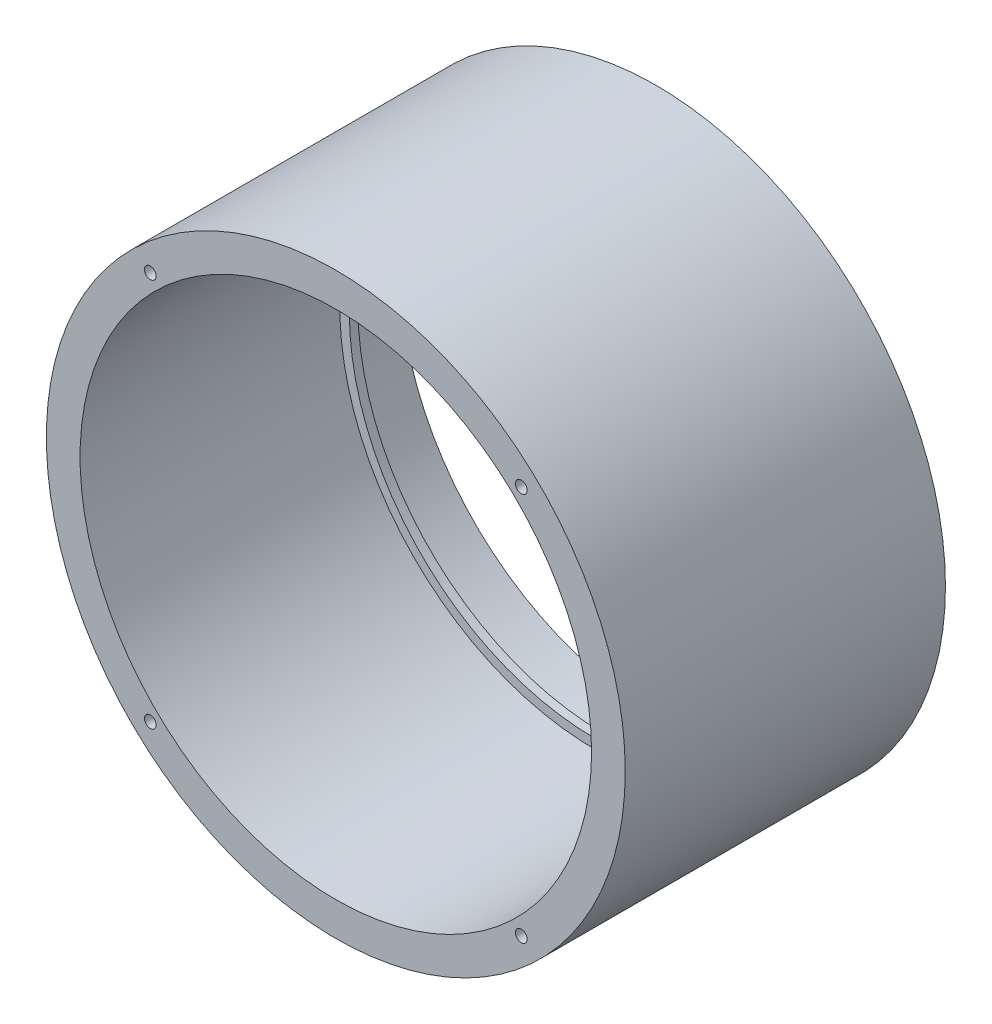
ISO-10303-21;
HEADER;
FILE_DESCRIPTION(('STEP AP214'),'2;1');
FILE_NAME('part.step','',(''),(''),'','','');
FILE_SCHEMA(('AUTOMOTIVE_DESIGN { 1 0 10303 214 1 1 1 1 }'));
ENDSEC;
DATA;
#1=APPLICATION_CONTEXT('core data for automotive mechanical design processes');
#2=APPLICATION_PROTOCOL_DEFINITION('international standard','automotive_design',2000,#1);
#3=PRODUCT_CONTEXT('',#1,'mechanical');
#4=PRODUCT('Part','Part','',(#3));
#5=PRODUCT_RELATED_PRODUCT_CATEGORY('part','',(#4));
#6=PRODUCT_DEFINITION_FORMATION('','',#4);
#7=PRODUCT_DEFINITION_CONTEXT('part definition',#1,'design');
#8=PRODUCT_DEFINITION('design','',#6,#7);
#9=PRODUCT_DEFINITION_SHAPE('','',#8);
#10=(LENGTH_UNIT() NAMED_UNIT(*) SI_UNIT(.MILLI.,.METRE.));
#11=(NAMED_UNIT(*) PLANE_ANGLE_UNIT() SI_UNIT($,.RADIAN.));
#12=(NAMED_UNIT(*) SI_UNIT($,.STERADIAN.) SOLID_ANGLE_UNIT());
#13=UNCERTAINTY_MEASURE_WITH_UNIT(LENGTH_MEASURE(1.E-05),#10,'distance_accuracy_value','');
#14=(GEOMETRIC_REPRESENTATION_CONTEXT(3) GLOBAL_UNCERTAINTY_ASSIGNED_CONTEXT((#13)) GLOBAL_UNIT_ASSIGNED_CONTEXT((#10,
#11,#12)) REPRESENTATION_CONTEXT('',''));
#15=CARTESIAN_POINT('',(0.,0.,0.));
#16=DIRECTION('',(0.,0.,1.));
#17=DIRECTION('',(1.,0.,0.));
#18=AXIS2_PLACEMENT_3D('',#15,#16,#17);
#19=CARTESIAN_POINT('',(0.,0.,185.3));
#20=DIRECTION('',(0.,0.,-1.));
#21=DIRECTION('',(-1.,0.,0.));
#22=AXIS2_PLACEMENT_3D('',#19,#20,#21);
#23=CYLINDRICAL_SURFACE('',#22,148.);
#24=CARTESIAN_POINT('',(0.,0.,35.));
#25=DIRECTION('',(0.,0.,1.));
#26=DIRECTION('',(1.,0.,0.));
#27=AXIS2_PLACEMENT_3D('',#24,#25,#26);
#28=CIRCLE('',#27,148.);
#29=CARTESIAN_POINT('',(148.,0.,35.));
#30=VERTEX_POINT('',#29);
#31=EDGE_CURVE('E10',#30,#30,#28,.T.);
#32=ORIENTED_EDGE('',*,*,#31,.F.);
#33=EDGE_LOOP('',(#32));
#34=FACE_BOUND('',#33,.T.);
#35=CARTESIAN_POINT('',(0.,0.,185.3));
#36=DIRECTION('',(0.,0.,1.));
#37=DIRECTION('',(1.,0.,0.));
#38=AXIS2_PLACEMENT_3D('',#35,#36,#37);
#39=CIRCLE('',#38,148.);
#40=CARTESIAN_POINT('',(148.,0.,185.3));
#41=VERTEX_POINT('',#40);
#42=EDGE_CURVE('E50',#41,#41,#39,.T.);
#43=ORIENTED_EDGE('',*,*,#42,.T.);
#44=EDGE_LOOP('',(#43));
#45=FACE_BOUND('',#44,.T.);
#46=ADVANCED_FACE('F31',(#34,#45),#23,.F.);
#47=CARTESIAN_POINT('',(0.,0.,185.3));
#48=DIRECTION('',(0.,0.,1.));
#49=DIRECTION('',(1.,0.,0.));
#50=AXIS2_PLACEMENT_3D('',#47,#48,#49);
#51=PLANE('',#50);
#52=CARTESIAN_POINT('',(-107.349895202557,112.5,185.3));
#53=DIRECTION('',(0.,0.,-1.));
#54=DIRECTION('',(-1.,0.,0.));
#55=AXIS2_PLACEMENT_3D('',#52,#53,#54);
#56=CIRCLE('',#55,3.4);
#57=CARTESIAN_POINT('',(-110.749895202557,112.5,185.3));
#58=VERTEX_POINT('',#57);
#59=EDGE_CURVE('E94',#58,#58,#56,.T.);
#60=ORIENTED_EDGE('',*,*,#59,.T.);
#61=EDGE_LOOP('',(#60));
#62=FACE_BOUND('',#61,.T.);
#63=CARTESIAN_POINT('',(107.349895202557,112.5,185.3));
#64=DIRECTION('',(0.,0.,-1.));
#65=DIRECTION('',(-1.,0.,0.));
#66=AXIS2_PLACEMENT_3D('',#63,#64,#65);
#67=CIRCLE('',#66,3.4);
#68=CARTESIAN_POINT('',(103.949895202557,112.5,185.3));
#69=VERTEX_POINT('',#68);
#70=EDGE_CURVE('E100',#69,#69,#67,.T.);
#71=ORIENTED_EDGE('',*,*,#70,.T.);
#72=EDGE_LOOP('',(#71));
#73=FACE_BOUND('',#72,.T.);
#74=CARTESIAN_POINT('',(107.349895202557,-112.5,185.3));
#75=DIRECTION('',(0.,0.,-1.));
#76=DIRECTION('',(-1.,0.,0.));
#77=AXIS2_PLACEMENT_3D('',#74,#75,#76);
#78=CIRCLE('',#77,3.4);
#79=CARTESIAN_POINT('',(103.949895202557,-112.5,185.3));
#80=VERTEX_POINT('',#79);
#81=EDGE_CURVE('E106',#80,#80,#78,.T.);
#82=ORIENTED_EDGE('',*,*,#81,.T.);
#83=EDGE_LOOP('',(#82));
#84=FACE_BOUND('',#83,.T.);
#85=CARTESIAN_POINT('',(-107.349895202557,-112.5,185.3));
#86=DIRECTION('',(0.,0.,-1.));
#87=DIRECTION('',(-1.,0.,0.));
#88=AXIS2_PLACEMENT_3D('',#85,#86,#87);
#89=CIRCLE('',#88,3.4);
#90=CARTESIAN_POINT('',(-110.749895202557,-112.5,185.3));
#91=VERTEX_POINT('',#90);
#92=EDGE_CURVE('E88',#91,#91,#89,.T.);
#93=ORIENTED_EDGE('',*,*,#92,.T.);
#94=EDGE_LOOP('',(#93));
#95=FACE_BOUND('',#94,.T.);
#96=CARTESIAN_POINT('',(0.,0.,185.3));
#97=DIRECTION('',(0.,0.,1.));
#98=DIRECTION('',(1.,0.,0.));
#99=AXIS2_PLACEMENT_3D('',#96,#97,#98);
#100=CIRCLE('',#99,167.5);
#101=CARTESIAN_POINT('',(167.5,0.,185.3));
#102=VERTEX_POINT('',#101);
#103=EDGE_CURVE('E42',#102,#102,#100,.T.);
#104=ORIENTED_EDGE('',*,*,#103,.T.);
#105=EDGE_LOOP('',(#104));
#106=FACE_BOUND('',#105,.T.);
#107=ORIENTED_EDGE('',*,*,#42,.F.);
#108=EDGE_LOOP('',(#107));
#109=FACE_BOUND('',#108,.T.);
#110=ADVANCED_FACE('F129',(#62,#73,#84,#95,#106,#109),#51,.T.);
#111=CARTESIAN_POINT('',(0.,0.,0.));
#112=DIRECTION('',(0.,0.,1.));
#113=DIRECTION('',(1.,0.,0.));
#114=AXIS2_PLACEMENT_3D('',#111,#112,#113);
#115=PLANE('',#114);
#116=CARTESIAN_POINT('',(-107.349895202557,112.5,0.));
#117=DIRECTION('',(0.,0.,-1.));
#118=DIRECTION('',(-1.,0.,0.));
#119=AXIS2_PLACEMENT_3D('',#116,#117,#118);
#120=CIRCLE('',#119,3.4);
#121=CARTESIAN_POINT('',(-110.749895202557,112.5,0.));
#122=VERTEX_POINT('',#121);
#123=EDGE_CURVE('E64',#122,#122,#120,.T.);
#124=ORIENTED_EDGE('',*,*,#123,.F.);
#125=EDGE_LOOP('',(#124));
#126=FACE_BOUND('',#125,.T.);
#127=CARTESIAN_POINT('',(107.349895202557,112.5,0.));
#128=DIRECTION('',(0.,0.,-1.));
#129=DIRECTION('',(-1.,0.,0.));
#130=AXIS2_PLACEMENT_3D('',#127,#128,#129);
#131=CIRCLE('',#130,3.4);
#132=CARTESIAN_POINT('',(103.949895202557,112.5,0.));
#133=VERTEX_POINT('',#132);
#134=EDGE_CURVE('E71',#133,#133,#131,.T.);
#135=ORIENTED_EDGE('',*,*,#134,.F.);
#136=EDGE_LOOP('',(#135));
#137=FACE_BOUND('',#136,.T.);
#138=CARTESIAN_POINT('',(107.349895202557,-112.5,0.));
#139=DIRECTION('',(0.,0.,-1.));
#140=DIRECTION('',(-1.,0.,0.));
#141=AXIS2_PLACEMENT_3D('',#138,#139,#140);
#142=CIRCLE('',#141,3.4);
#143=CARTESIAN_POINT('',(103.949895202557,-112.5,0.));
#144=VERTEX_POINT('',#143);
#145=EDGE_CURVE('E77',#144,#144,#142,.T.);
#146=ORIENTED_EDGE('',*,*,#145,.F.);
#147=EDGE_LOOP('',(#146));
#148=FACE_BOUND('',#147,.T.);
#149=CARTESIAN_POINT('',(-107.349895202557,-112.5,0.));
#150=DIRECTION('',(0.,0.,-1.));
#151=DIRECTION('',(-1.,0.,0.));
#152=AXIS2_PLACEMENT_3D('',#149,#150,#151);
#153=CIRCLE('',#152,3.4);
#154=CARTESIAN_POINT('',(-110.749895202557,-112.5,0.));
#155=VERTEX_POINT('',#154);
#156=EDGE_CURVE('E58',#155,#155,#153,.T.);
#157=ORIENTED_EDGE('',*,*,#156,.F.);
#158=EDGE_LOOP('',(#157));
#159=FACE_BOUND('',#158,.T.);
#160=CARTESIAN_POINT('',(0.,0.,0.));
#161=DIRECTION('',(0.,0.,1.));
#162=DIRECTION('',(1.,0.,0.));
#163=AXIS2_PLACEMENT_3D('',#160,#161,#162);
#164=CIRCLE('',#163,167.5);
#165=CARTESIAN_POINT('',(167.5,0.,0.));
#166=VERTEX_POINT('',#165);
#167=EDGE_CURVE('E46',#166,#166,#164,.T.);
#168=ORIENTED_EDGE('',*,*,#167,.F.);
#169=EDGE_LOOP('',(#168));
#170=FACE_BOUND('',#169,.T.);
#171=CARTESIAN_POINT('',(0.,0.,0.));
#172=DIRECTION('',(0.,0.,1.));
#173=DIRECTION('',(1.,0.,0.));
#174=AXIS2_PLACEMENT_3D('',#171,#172,#173);
#175=CIRCLE('',#174,148.);
#176=CARTESIAN_POINT('',(148.,0.,0.));
#177=VERTEX_POINT('',#176);
#178=EDGE_CURVE('E52',#177,#177,#175,.T.);
#179=ORIENTED_EDGE('',*,*,#178,.T.);
#180=EDGE_LOOP('',(#179));
#181=FACE_BOUND('',#180,.T.);
#182=ADVANCED_FACE('F137',(#126,#137,#148,#159,#170,#181),#115,.F.);
#183=CARTESIAN_POINT('',(0.,0.,185.3));
#184=DIRECTION('',(0.,0.,-1.));
#185=DIRECTION('',(-1.,0.,0.));
#186=AXIS2_PLACEMENT_3D('',#183,#184,#185);
#187=CYLINDRICAL_SURFACE('',#186,167.5);
#188=ORIENTED_EDGE('',*,*,#103,.F.);
#189=EDGE_LOOP('',(#188));
#190=FACE_BOUND('',#189,.T.);
#191=ORIENTED_EDGE('',*,*,#167,.T.);
#192=EDGE_LOOP('',(#191));
#193=FACE_BOUND('',#192,.T.);
#194=ADVANCED_FACE('F33',(#190,#193),#187,.T.);
#195=CARTESIAN_POINT('',(0.,0.,30.));
#196=DIRECTION('',(0.,0.,-1.));
#197=DIRECTION('',(-1.,0.,0.));
#198=AXIS2_PLACEMENT_3D('',#195,#196,#197);
#199=CIRCLE('',#198,148.);
#200=CARTESIAN_POINT('',(-148.,0.,30.));
#201=VERTEX_POINT('',#200);
#202=EDGE_CURVE('E38',#201,#201,#199,.T.);
#203=ORIENTED_EDGE('',*,*,#202,.F.);
#204=EDGE_LOOP('',(#203));
#205=FACE_BOUND('',#204,.T.);
#206=ORIENTED_EDGE('',*,*,#178,.F.);
#207=EDGE_LOOP('',(#206));
#208=FACE_BOUND('',#207,.T.);
#209=ADVANCED_FACE('F132',(#205,#208),#23,.F.);
#210=CARTESIAN_POINT('',(-107.349895202557,-112.5,15.));
#211=DIRECTION('',(0.,0.,-1.));
#212=DIRECTION('',(-1.,0.,0.));
#213=AXIS2_PLACEMENT_3D('',#210,#211,#212);
#214=CYLINDRICAL_SURFACE('',#213,3.4);
#215=CARTESIAN_POINT('',(-107.349895202557,-112.5,15.));
#216=DIRECTION('',(0.,0.,-1.));
#217=DIRECTION('',(-1.,0.,0.));
#218=AXIS2_PLACEMENT_3D('',#215,#216,#217);
#219=CIRCLE('',#218,3.4);
#220=CARTESIAN_POINT('',(-110.749895202557,-112.5,15.));
#221=VERTEX_POINT('',#220);
#222=EDGE_CURVE('E55',#221,#221,#219,.T.);
#223=ORIENTED_EDGE('',*,*,#222,.F.);
#224=EDGE_LOOP('',(#223));
#225=FACE_BOUND('',#224,.T.);
#226=ORIENTED_EDGE('',*,*,#156,.T.);
#227=EDGE_LOOP('',(#226));
#228=FACE_BOUND('',#227,.T.);
#229=ADVANCED_FACE('F143',(#225,#228),#214,.F.);
#230=CARTESIAN_POINT('',(-107.349895202557,-112.5,15.));
#231=DIRECTION('',(0.,0.,-1.));
#232=DIRECTION('',(-1.,0.,0.));
#233=AXIS2_PLACEMENT_3D('',#230,#231,#232);
#234=PLANE('',#233);
#235=ORIENTED_EDGE('',*,*,#222,.T.);
#236=EDGE_LOOP('',(#235));
#237=FACE_BOUND('',#236,.T.);
#238=ADVANCED_FACE('F149',(#237),#234,.T.);
#239=CARTESIAN_POINT('',(107.349895202557,-112.5,15.));
#240=DIRECTION('',(0.,0.,-1.));
#241=DIRECTION('',(-1.,0.,0.));
#242=AXIS2_PLACEMENT_3D('',#239,#240,#241);
#243=CYLINDRICAL_SURFACE('',#242,3.4);
#244=CARTESIAN_POINT('',(107.349895202557,-112.5,15.));
#245=DIRECTION('',(0.,0.,-1.));
#246=DIRECTION('',(-1.,0.,0.));
#247=AXIS2_PLACEMENT_3D('',#244,#245,#246);
#248=CIRCLE('',#247,3.4);
#249=CARTESIAN_POINT('',(103.949895202557,-112.5,15.));
#250=VERTEX_POINT('',#249);
#251=EDGE_CURVE('E61',#250,#250,#248,.T.);
#252=ORIENTED_EDGE('',*,*,#251,.F.);
#253=EDGE_LOOP('',(#252));
#254=FACE_BOUND('',#253,.T.);
#255=ORIENTED_EDGE('',*,*,#145,.T.);
#256=EDGE_LOOP('',(#255));
#257=FACE_BOUND('',#256,.T.);
#258=ADVANCED_FACE('F171',(#254,#257),#243,.F.);
#259=CARTESIAN_POINT('',(107.349895202557,-112.5,15.));
#260=DIRECTION('',(0.,0.,-1.));
#261=DIRECTION('',(-1.,0.,0.));
#262=AXIS2_PLACEMENT_3D('',#259,#260,#261);
#263=PLANE('',#262);
#264=ORIENTED_EDGE('',*,*,#251,.T.);
#265=EDGE_LOOP('',(#264));
#266=FACE_BOUND('',#265,.T.);
#267=ADVANCED_FACE('F173',(#266),#263,.T.);
#268=CARTESIAN_POINT('',(107.349895202557,112.5,15.));
#269=DIRECTION('',(0.,0.,-1.));
#270=DIRECTION('',(-1.,0.,0.));
#271=AXIS2_PLACEMENT_3D('',#268,#269,#270);
#272=CYLINDRICAL_SURFACE('',#271,3.4);
#273=CARTESIAN_POINT('',(107.349895202557,112.5,15.));
#274=DIRECTION('',(0.,0.,-1.));
#275=DIRECTION('',(-1.,0.,0.));
#276=AXIS2_PLACEMENT_3D('',#273,#274,#275);
#277=CIRCLE('',#276,3.4);
#278=CARTESIAN_POINT('',(103.949895202557,112.5,15.));
#279=VERTEX_POINT('',#278);
#280=EDGE_CURVE('E74',#279,#279,#277,.T.);
#281=ORIENTED_EDGE('',*,*,#280,.F.);
#282=EDGE_LOOP('',(#281));
#283=FACE_BOUND('',#282,.T.);
#284=ORIENTED_EDGE('',*,*,#134,.T.);
#285=EDGE_LOOP('',(#284));
#286=FACE_BOUND('',#285,.T.);
#287=ADVANCED_FACE('F180',(#283,#286),#272,.F.);
#288=CARTESIAN_POINT('',(107.349895202557,112.5,15.));
#289=DIRECTION('',(0.,0.,-1.));
#290=DIRECTION('',(-1.,0.,0.));
#291=AXIS2_PLACEMENT_3D('',#288,#289,#290);
#292=PLANE('',#291);
#293=ORIENTED_EDGE('',*,*,#280,.T.);
#294=EDGE_LOOP('',(#293));
#295=FACE_BOUND('',#294,.T.);
#296=ADVANCED_FACE('F188',(#295),#292,.T.);
#297=CARTESIAN_POINT('',(-107.349895202557,112.5,15.));
#298=DIRECTION('',(0.,0.,-1.));
#299=DIRECTION('',(-1.,0.,0.));
#300=AXIS2_PLACEMENT_3D('',#297,#298,#299);
#301=CYLINDRICAL_SURFACE('',#300,3.4);
#302=CARTESIAN_POINT('',(-107.349895202557,112.5,15.));
#303=DIRECTION('',(0.,0.,-1.));
#304=DIRECTION('',(-1.,0.,0.));
#305=AXIS2_PLACEMENT_3D('',#302,#303,#304);
#306=CIRCLE('',#305,3.4);
#307=CARTESIAN_POINT('',(-110.749895202557,112.5,15.));
#308=VERTEX_POINT('',#307);
#309=EDGE_CURVE('E67',#308,#308,#306,.T.);
#310=ORIENTED_EDGE('',*,*,#309,.F.);
#311=EDGE_LOOP('',(#310));
#312=FACE_BOUND('',#311,.T.);
#313=ORIENTED_EDGE('',*,*,#123,.T.);
#314=EDGE_LOOP('',(#313));
#315=FACE_BOUND('',#314,.T.);
#316=ADVANCED_FACE('F191',(#312,#315),#301,.F.);
#317=CARTESIAN_POINT('',(-107.349895202557,112.5,15.));
#318=DIRECTION('',(0.,0.,-1.));
#319=DIRECTION('',(-1.,0.,0.));
#320=AXIS2_PLACEMENT_3D('',#317,#318,#319);
#321=PLANE('',#320);
#322=ORIENTED_EDGE('',*,*,#309,.T.);
#323=EDGE_LOOP('',(#322));
#324=FACE_BOUND('',#323,.T.);
#325=ADVANCED_FACE('F196',(#324),#321,.T.);
#326=CARTESIAN_POINT('',(0.,158.907796145232,35.));
#327=DIRECTION('',(0.,0.,1.));
#328=DIRECTION('',(1.,0.,0.));
#329=AXIS2_PLACEMENT_3D('',#326,#327,#328);
#330=PLANE('',#329);
#331=CARTESIAN_POINT('',(0.,0.,35.));
#332=DIRECTION('',(0.,0.,-1.));
#333=DIRECTION('',(-1.,0.,0.));
#334=AXIS2_PLACEMENT_3D('',#331,#332,#333);
#335=CIRCLE('',#334,142.5);
#336=CARTESIAN_POINT('',(-142.5,0.,35.));
#337=VERTEX_POINT('',#336);
#338=EDGE_CURVE('E68',#337,#337,#335,.T.);
#339=ORIENTED_EDGE('',*,*,#338,.T.);
#340=EDGE_LOOP('',(#339));
#341=FACE_BOUND('',#340,.T.);
#342=ORIENTED_EDGE('',*,*,#31,.T.);
#343=EDGE_LOOP('',(#342));
#344=FACE_BOUND('',#343,.T.);
#345=ADVANCED_FACE('F199',(#341,#344),#330,.T.);
#346=CARTESIAN_POINT('',(0.,158.907796145232,30.));
#347=DIRECTION('',(0.,0.,-1.));
#348=DIRECTION('',(-1.,0.,0.));
#349=AXIS2_PLACEMENT_3D('',#346,#347,#348);
#350=PLANE('',#349);
#351=CARTESIAN_POINT('',(0.,0.,30.));
#352=DIRECTION('',(0.,0.,-1.));
#353=DIRECTION('',(-1.,0.,0.));
#354=AXIS2_PLACEMENT_3D('',#351,#352,#353);
#355=CIRCLE('',#354,142.5);
#356=CARTESIAN_POINT('',(-142.5,0.,30.));
#357=VERTEX_POINT('',#356);
#358=EDGE_CURVE('E84',#357,#357,#355,.T.);
#359=ORIENTED_EDGE('',*,*,#358,.F.);
#360=EDGE_LOOP('',(#359));
#361=FACE_BOUND('',#360,.T.);
#362=ORIENTED_EDGE('',*,*,#202,.T.);
#363=EDGE_LOOP('',(#362));
#364=FACE_BOUND('',#363,.T.);
#365=ADVANCED_FACE('F219',(#361,#364),#350,.T.);
#366=CARTESIAN_POINT('',(0.,0.,0.));
#367=DIRECTION('',(0.,0.,-1.));
#368=DIRECTION('',(-1.,0.,0.));
#369=AXIS2_PLACEMENT_3D('',#366,#367,#368);
#370=CYLINDRICAL_SURFACE('',#369,142.5);
#371=ORIENTED_EDGE('',*,*,#358,.T.);
#372=EDGE_LOOP('',(#371));
#373=FACE_BOUND('',#372,.T.);
#374=ORIENTED_EDGE('',*,*,#338,.F.);
#375=EDGE_LOOP('',(#374));
#376=FACE_BOUND('',#375,.T.);
#377=ADVANCED_FACE('F226',(#373,#376),#370,.F.);
#378=CARTESIAN_POINT('',(-107.349895202557,-112.5,170.3));
#379=DIRECTION('',(0.,0.,1.));
#380=DIRECTION('',(1.,0.,0.));
#381=AXIS2_PLACEMENT_3D('',#378,#379,#380);
#382=CYLINDRICAL_SURFACE('',#381,3.4);
#383=CARTESIAN_POINT('',(-107.349895202557,-112.5,170.3));
#384=DIRECTION('',(0.,0.,-1.));
#385=DIRECTION('',(-1.,0.,0.));
#386=AXIS2_PLACEMENT_3D('',#383,#384,#385);
#387=CIRCLE('',#386,3.4);
#388=CARTESIAN_POINT('',(-110.749895202557,-112.5,170.3));
#389=VERTEX_POINT('',#388);
#390=EDGE_CURVE('E87',#389,#389,#387,.T.);
#391=ORIENTED_EDGE('',*,*,#390,.T.);
#392=EDGE_LOOP('',(#391));
#393=FACE_BOUND('',#392,.T.);
#394=ORIENTED_EDGE('',*,*,#92,.F.);
#395=EDGE_LOOP('',(#394));
#396=FACE_BOUND('',#395,.T.);
#397=ADVANCED_FACE('F234',(#393,#396),#382,.F.);
#398=CARTESIAN_POINT('',(-107.349895202557,-112.5,170.3));
#399=DIRECTION('',(0.,0.,1.));
#400=DIRECTION('',(-1.,0.,0.));
#401=AXIS2_PLACEMENT_3D('',#398,#399,#400);
#402=PLANE('',#401);
#403=ORIENTED_EDGE('',*,*,#390,.F.);
#404=EDGE_LOOP('',(#403));
#405=FACE_BOUND('',#404,.T.);
#406=ADVANCED_FACE('F126',(#405),#402,.T.);
#407=CARTESIAN_POINT('',(107.349895202557,-112.5,170.3));
#408=DIRECTION('',(0.,0.,1.));
#409=DIRECTION('',(1.,0.,0.));
#410=AXIS2_PLACEMENT_3D('',#407,#408,#409);
#411=CYLINDRICAL_SURFACE('',#410,3.4);
#412=CARTESIAN_POINT('',(107.349895202557,-112.5,170.3));
#413=DIRECTION('',(0.,0.,-1.));
#414=DIRECTION('',(-1.,0.,0.));
#415=AXIS2_PLACEMENT_3D('',#412,#413,#414);
#416=CIRCLE('',#415,3.4);
#417=CARTESIAN_POINT('',(103.949895202557,-112.5,170.3));
#418=VERTEX_POINT('',#417);
#419=EDGE_CURVE('E91',#418,#418,#416,.T.);
#420=ORIENTED_EDGE('',*,*,#419,.T.);
#421=EDGE_LOOP('',(#420));
#422=FACE_BOUND('',#421,.T.);
#423=ORIENTED_EDGE('',*,*,#81,.F.);
#424=EDGE_LOOP('',(#423));
#425=FACE_BOUND('',#424,.T.);
#426=ADVANCED_FACE('F112',(#422,#425),#411,.F.);
#427=CARTESIAN_POINT('',(107.349895202557,-112.5,170.3));
#428=DIRECTION('',(0.,0.,1.));
#429=DIRECTION('',(-1.,0.,0.));
#430=AXIS2_PLACEMENT_3D('',#427,#428,#429);
#431=PLANE('',#430);
#432=ORIENTED_EDGE('',*,*,#419,.F.);
#433=EDGE_LOOP('',(#432));
#434=FACE_BOUND('',#433,.T.);
#435=ADVANCED_FACE('F115',(#434),#431,.T.);
#436=CARTESIAN_POINT('',(107.349895202557,112.5,170.3));
#437=DIRECTION('',(0.,0.,1.));
#438=DIRECTION('',(1.,0.,0.));
#439=AXIS2_PLACEMENT_3D('',#436,#437,#438);
#440=CYLINDRICAL_SURFACE('',#439,3.4);
#441=CARTESIAN_POINT('',(107.349895202557,112.5,170.3));
#442=DIRECTION('',(0.,0.,-1.));
#443=DIRECTION('',(-1.,0.,0.));
#444=AXIS2_PLACEMENT_3D('',#441,#442,#443);
#445=CIRCLE('',#444,3.4);
#446=CARTESIAN_POINT('',(103.949895202557,112.5,170.3));
#447=VERTEX_POINT('',#446);
#448=EDGE_CURVE('E103',#447,#447,#445,.T.);
#449=ORIENTED_EDGE('',*,*,#448,.T.);
#450=EDGE_LOOP('',(#449));
#451=FACE_BOUND('',#450,.T.);
#452=ORIENTED_EDGE('',*,*,#70,.F.);
#453=EDGE_LOOP('',(#452));
#454=FACE_BOUND('',#453,.T.);
#455=ADVANCED_FACE('F117',(#451,#454),#440,.F.);
#456=CARTESIAN_POINT('',(107.349895202557,112.5,170.3));
#457=DIRECTION('',(0.,0.,1.));
#458=DIRECTION('',(-1.,0.,0.));
#459=AXIS2_PLACEMENT_3D('',#456,#457,#458);
#460=PLANE('',#459);
#461=ORIENTED_EDGE('',*,*,#448,.F.);
#462=EDGE_LOOP('',(#461));
#463=FACE_BOUND('',#462,.T.);
#464=ADVANCED_FACE('F123',(#463),#460,.T.);
#465=CARTESIAN_POINT('',(-107.349895202557,112.5,170.3));
#466=DIRECTION('',(0.,0.,1.));
#467=DIRECTION('',(1.,0.,0.));
#468=AXIS2_PLACEMENT_3D('',#465,#466,#467);
#469=CYLINDRICAL_SURFACE('',#468,3.4);
#470=CARTESIAN_POINT('',(-107.349895202557,112.5,170.3));
#471=DIRECTION('',(0.,0.,-1.));
#472=DIRECTION('',(-1.,0.,0.));
#473=AXIS2_PLACEMENT_3D('',#470,#471,#472);
#474=CIRCLE('',#473,3.4);
#475=CARTESIAN_POINT('',(-110.749895202557,112.5,170.3));
#476=VERTEX_POINT('',#475);
#477=EDGE_CURVE('E97',#476,#476,#474,.T.);
#478=ORIENTED_EDGE('',*,*,#477,.T.);
#479=EDGE_LOOP('',(#478));
#480=FACE_BOUND('',#479,.T.);
#481=ORIENTED_EDGE('',*,*,#59,.F.);
#482=EDGE_LOOP('',(#481));
#483=FACE_BOUND('',#482,.T.);
#484=ADVANCED_FACE('F273',(#480,#483),#469,.F.);
#485=CARTESIAN_POINT('',(-107.349895202557,112.5,170.3));
#486=DIRECTION('',(0.,0.,1.));
#487=DIRECTION('',(-1.,0.,0.));
#488=AXIS2_PLACEMENT_3D('',#485,#486,#487);
#489=PLANE('',#488);
#490=ORIENTED_EDGE('',*,*,#477,.F.);
#491=EDGE_LOOP('',(#490));
#492=FACE_BOUND('',#491,.T.);
#493=ADVANCED_FACE('F283',(#492),#489,.T.);
#494=CLOSED_SHELL('',(#46,#110,#182,#194,#209,#229,#238,#258,#267,#287,#296,#316,#325,#345,#365,
#377,#397,#406,#426,#435,#455,#464,#484,#493));
#495=MANIFOLD_SOLID_BREP('B2',#494);
#496=ADVANCED_BREP_SHAPE_REPRESENTATION('',(#18,#495),#14);
#497=SHAPE_DEFINITION_REPRESENTATION(#9,#496);
ENDSEC;
END-ISO-10303-21;
